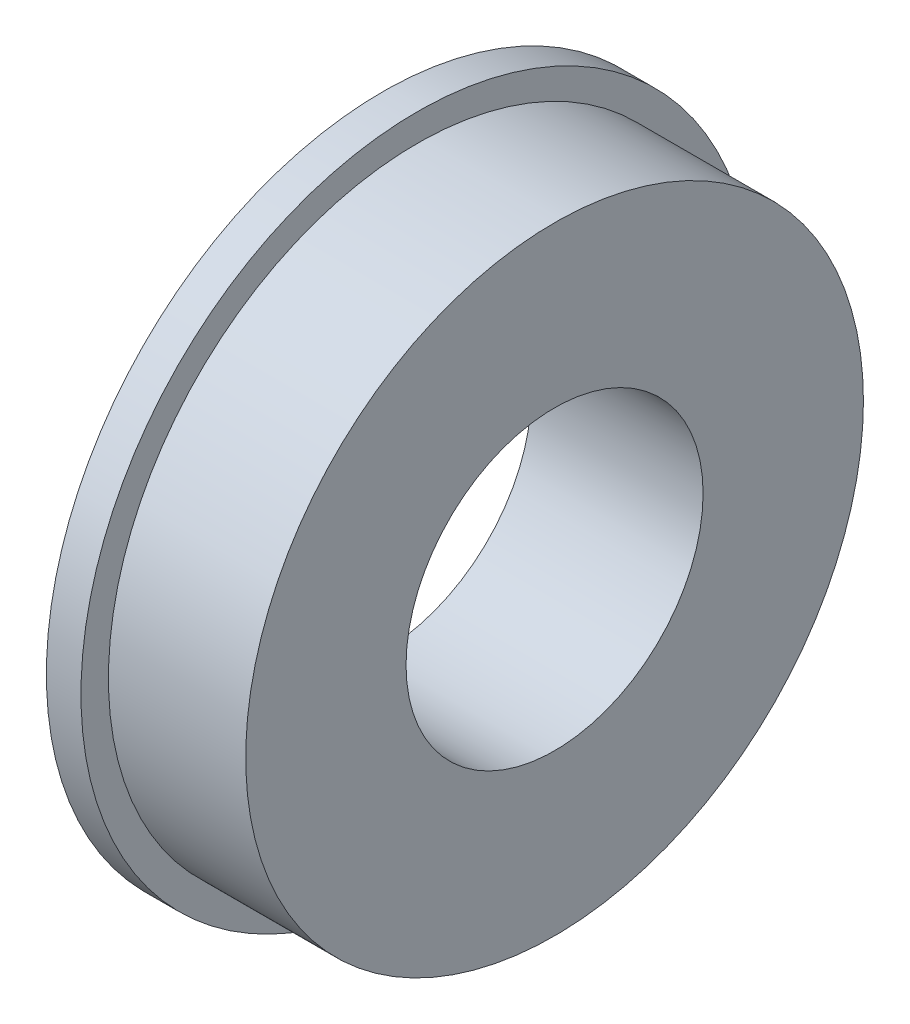
ISO-10303-21;
HEADER;
FILE_DESCRIPTION(('STEP AP214'),'2;1');
FILE_NAME('part.step','',(''),(''),'','','');
FILE_SCHEMA(('AUTOMOTIVE_DESIGN { 1 0 10303 214 1 1 1 1 }'));
ENDSEC;
DATA;
#1=APPLICATION_CONTEXT('core data for automotive mechanical design processes');
#2=APPLICATION_PROTOCOL_DEFINITION('international standard','automotive_design',2000,#1);
#3=PRODUCT_CONTEXT('',#1,'mechanical');
#4=PRODUCT('Part','Part','',(#3));
#5=PRODUCT_RELATED_PRODUCT_CATEGORY('part','',(#4));
#6=PRODUCT_DEFINITION_FORMATION('','',#4);
#7=PRODUCT_DEFINITION_CONTEXT('part definition',#1,'design');
#8=PRODUCT_DEFINITION('design','',#6,#7);
#9=PRODUCT_DEFINITION_SHAPE('','',#8);
#10=(LENGTH_UNIT() NAMED_UNIT(*) SI_UNIT(.MILLI.,.METRE.));
#11=(NAMED_UNIT(*) PLANE_ANGLE_UNIT() SI_UNIT($,.RADIAN.));
#12=(NAMED_UNIT(*) SI_UNIT($,.STERADIAN.) SOLID_ANGLE_UNIT());
#13=UNCERTAINTY_MEASURE_WITH_UNIT(LENGTH_MEASURE(1.E-05),#10,'distance_accuracy_value','');
#14=(GEOMETRIC_REPRESENTATION_CONTEXT(3) GLOBAL_UNCERTAINTY_ASSIGNED_CONTEXT((#13)) GLOBAL_UNIT_ASSIGNED_CONTEXT((#10,
#11,#12)) REPRESENTATION_CONTEXT('',''));
#15=CARTESIAN_POINT('',(0.,0.,0.));
#16=DIRECTION('',(0.,0.,1.));
#17=DIRECTION('',(1.,0.,0.));
#18=AXIS2_PLACEMENT_3D('',#15,#16,#17);
#19=CARTESIAN_POINT('',(-3.97509999999998,3.97509999999537,0.));
#20=DIRECTION('',(-1.,-1.16271575700821E-12,0.));
#21=DIRECTION('',(0.,0.,1.));
#22=AXIS2_PLACEMENT_3D('',#19,#20,#21);
#23=PLANE('',#22);
#24=CARTESIAN_POINT('',(-3.97509999999998,3.97509999999537,0.));
#25=DIRECTION('',(1.,1.16271575700821E-12,0.));
#26=DIRECTION('',(0.,0.,-1.));
#27=AXIS2_PLACEMENT_3D('',#24,#25,#26);
#28=CIRCLE('',#27,6.8707);
#29=CARTESIAN_POINT('',(-3.97509999999998,3.97509999999537,-6.8707));
#30=VERTEX_POINT('',#29);
#31=EDGE_CURVE('E10',#30,#30,#28,.T.);
#32=ORIENTED_EDGE('',*,*,#31,.T.);
#33=EDGE_LOOP('',(#32));
#34=FACE_BOUND('',#33,.T.);
#35=CARTESIAN_POINT('',(-3.97509999999998,3.97509999999537,0.));
#36=DIRECTION('',(1.,1.16271575700821E-12,0.));
#37=DIRECTION('',(0.,0.,-1.));
#38=AXIS2_PLACEMENT_3D('',#35,#36,#37);
#39=CIRCLE('',#38,9.7663);
#40=CARTESIAN_POINT('',(-3.97509999999998,3.97509999999537,-9.7663));
#41=VERTEX_POINT('',#40);
#42=EDGE_CURVE('E84',#41,#41,#39,.T.);
#43=ORIENTED_EDGE('',*,*,#42,.F.);
#44=EDGE_LOOP('',(#43));
#45=FACE_BOUND('',#44,.T.);
#46=ADVANCED_FACE('F41',(#34,#45),#23,.T.);
#47=CARTESIAN_POINT('',(3.97510000000002,3.97510000000461,0.));
#48=DIRECTION('',(1.,1.16271575700821E-12,0.));
#49=DIRECTION('',(0.,0.,-1.));
#50=AXIS2_PLACEMENT_3D('',#47,#48,#49);
#51=CYLINDRICAL_SURFACE('',#50,6.8707);
#52=CARTESIAN_POINT('',(3.97510000000002,3.97510000000461,0.));
#53=DIRECTION('',(1.,1.16271575700821E-12,0.));
#54=DIRECTION('',(0.,0.,-1.));
#55=AXIS2_PLACEMENT_3D('',#52,#53,#54);
#56=CIRCLE('',#55,6.8707);
#57=CARTESIAN_POINT('',(3.97510000000002,3.97510000000461,-6.8707));
#58=VERTEX_POINT('',#57);
#59=EDGE_CURVE('E48',#58,#58,#56,.T.);
#60=ORIENTED_EDGE('',*,*,#59,.T.);
#61=EDGE_LOOP('',(#60));
#62=FACE_BOUND('',#61,.T.);
#63=ORIENTED_EDGE('',*,*,#31,.F.);
#64=EDGE_LOOP('',(#63));
#65=FACE_BOUND('',#64,.T.);
#66=ADVANCED_FACE('F93',(#62,#65),#51,.F.);
#67=CARTESIAN_POINT('',(3.97510000000002,3.97510000000461,0.));
#68=DIRECTION('',(1.,1.16271575700821E-12,0.));
#69=DIRECTION('',(0.,0.,-1.));
#70=AXIS2_PLACEMENT_3D('',#67,#68,#69);
#71=PLANE('',#70);
#72=CARTESIAN_POINT('',(3.97510000000002,3.97510000000461,0.));
#73=DIRECTION('',(1.,1.16271575700821E-12,0.));
#74=DIRECTION('',(0.,0.,-1.));
#75=AXIS2_PLACEMENT_3D('',#72,#73,#74);
#76=CIRCLE('',#75,14.2875);
#77=CARTESIAN_POINT('',(3.97510000000002,3.97510000000461,-14.2875));
#78=VERTEX_POINT('',#77);
#79=EDGE_CURVE('E53',#78,#78,#76,.T.);
#80=ORIENTED_EDGE('',*,*,#79,.T.);
#81=EDGE_LOOP('',(#80));
#82=FACE_BOUND('',#81,.T.);
#83=ORIENTED_EDGE('',*,*,#59,.F.);
#84=EDGE_LOOP('',(#83));
#85=FACE_BOUND('',#84,.T.);
#86=ADVANCED_FACE('F97',(#82,#85),#71,.T.);
#87=CARTESIAN_POINT('',(3.97510000000002,3.97510000000461,0.));
#88=DIRECTION('',(1.,1.16271575700821E-12,0.));
#89=DIRECTION('',(0.,0.,-1.));
#90=AXIS2_PLACEMENT_3D('',#87,#88,#89);
#91=CYLINDRICAL_SURFACE('',#90,14.2875);
#92=CARTESIAN_POINT('',(-2.37489999999998,3.97509999999723,0.));
#93=DIRECTION('',(1.,1.16271575700821E-12,0.));
#94=DIRECTION('',(0.,0.,-1.));
#95=AXIS2_PLACEMENT_3D('',#92,#93,#94);
#96=CIRCLE('',#95,14.2875);
#97=CARTESIAN_POINT('',(-2.37489999999998,3.97509999999723,-14.2875));
#98=VERTEX_POINT('',#97);
#99=EDGE_CURVE('E58',#98,#98,#96,.T.);
#100=ORIENTED_EDGE('',*,*,#99,.T.);
#101=EDGE_LOOP('',(#100));
#102=FACE_BOUND('',#101,.T.);
#103=ORIENTED_EDGE('',*,*,#79,.F.);
#104=EDGE_LOOP('',(#103));
#105=FACE_BOUND('',#104,.T.);
#106=ADVANCED_FACE('F101',(#102,#105),#91,.T.);
#107=CARTESIAN_POINT('',(-2.37489999999998,3.97509999999723,0.));
#108=DIRECTION('',(1.,1.16271575700821E-12,0.));
#109=DIRECTION('',(0.,0.,-1.));
#110=AXIS2_PLACEMENT_3D('',#107,#108,#109);
#111=PLANE('',#110);
#112=CARTESIAN_POINT('',(-2.37489999999998,3.97509999999723,0.));
#113=DIRECTION('',(1.,1.16271575700821E-12,0.));
#114=DIRECTION('',(0.,0.,-1.));
#115=AXIS2_PLACEMENT_3D('',#112,#113,#114);
#116=CIRCLE('',#115,15.5575);
#117=CARTESIAN_POINT('',(-2.37489999999998,3.97509999999723,-15.5575));
#118=VERTEX_POINT('',#117);
#119=EDGE_CURVE('E64',#118,#118,#116,.T.);
#120=ORIENTED_EDGE('',*,*,#119,.T.);
#121=EDGE_LOOP('',(#120));
#122=FACE_BOUND('',#121,.T.);
#123=ORIENTED_EDGE('',*,*,#99,.F.);
#124=EDGE_LOOP('',(#123));
#125=FACE_BOUND('',#124,.T.);
#126=ADVANCED_FACE('F108',(#122,#125),#111,.T.);
#127=CARTESIAN_POINT('',(3.97510000000002,3.97510000000461,0.));
#128=DIRECTION('',(1.,1.16271575700821E-12,0.));
#129=DIRECTION('',(0.,0.,-1.));
#130=AXIS2_PLACEMENT_3D('',#127,#128,#129);
#131=CYLINDRICAL_SURFACE('',#130,15.5575);
#132=CARTESIAN_POINT('',(-3.97509999999998,3.97509999999537,0.));
#133=DIRECTION('',(1.,1.16271575700821E-12,0.));
#134=DIRECTION('',(0.,0.,-1.));
#135=AXIS2_PLACEMENT_3D('',#132,#133,#134);
#136=CIRCLE('',#135,15.5575);
#137=CARTESIAN_POINT('',(-3.97509999999998,3.97509999999537,-15.5575));
#138=VERTEX_POINT('',#137);
#139=EDGE_CURVE('E68',#138,#138,#136,.T.);
#140=ORIENTED_EDGE('',*,*,#139,.T.);
#141=EDGE_LOOP('',(#140));
#142=FACE_BOUND('',#141,.T.);
#143=ORIENTED_EDGE('',*,*,#119,.F.);
#144=EDGE_LOOP('',(#143));
#145=FACE_BOUND('',#144,.T.);
#146=ADVANCED_FACE('F112',(#142,#145),#131,.T.);
#147=CARTESIAN_POINT('',(-3.97509999999998,3.97509999999537,0.));
#148=DIRECTION('',(-1.,-1.16271575700821E-12,0.));
#149=DIRECTION('',(0.,0.,1.));
#150=AXIS2_PLACEMENT_3D('',#147,#148,#149);
#151=PLANE('',#150);
#152=CARTESIAN_POINT('',(-3.97509999999998,3.97509999999537,0.));
#153=DIRECTION('',(1.,1.16271575700821E-12,0.));
#154=DIRECTION('',(0.,0.,-1.));
#155=AXIS2_PLACEMENT_3D('',#152,#153,#154);
#156=CIRCLE('',#155,12.6619);
#157=CARTESIAN_POINT('',(-3.97509999999998,3.97509999999537,-12.6619));
#158=VERTEX_POINT('',#157);
#159=EDGE_CURVE('E72',#158,#158,#156,.T.);
#160=ORIENTED_EDGE('',*,*,#159,.T.);
#161=EDGE_LOOP('',(#160));
#162=FACE_BOUND('',#161,.T.);
#163=ORIENTED_EDGE('',*,*,#139,.F.);
#164=EDGE_LOOP('',(#163));
#165=FACE_BOUND('',#164,.T.);
#166=ADVANCED_FACE('F116',(#162,#165),#151,.T.);
#167=CARTESIAN_POINT('',(3.97510000000002,3.97510000000461,0.));
#168=DIRECTION('',(1.,1.16271575700821E-12,0.));
#169=DIRECTION('',(0.,0.,-1.));
#170=AXIS2_PLACEMENT_3D('',#167,#168,#169);
#171=CYLINDRICAL_SURFACE('',#170,12.6619);
#172=CARTESIAN_POINT('',(-3.34009999999998,3.97509999999611,0.));
#173=DIRECTION('',(1.,1.16271575700821E-12,0.));
#174=DIRECTION('',(0.,0.,-1.));
#175=AXIS2_PLACEMENT_3D('',#172,#173,#174);
#176=CIRCLE('',#175,12.6619);
#177=CARTESIAN_POINT('',(-3.34009999999998,3.97509999999611,-12.6619));
#178=VERTEX_POINT('',#177);
#179=EDGE_CURVE('E76',#178,#178,#176,.T.);
#180=ORIENTED_EDGE('',*,*,#179,.T.);
#181=EDGE_LOOP('',(#180));
#182=FACE_BOUND('',#181,.T.);
#183=ORIENTED_EDGE('',*,*,#159,.F.);
#184=EDGE_LOOP('',(#183));
#185=FACE_BOUND('',#184,.T.);
#186=ADVANCED_FACE('F120',(#182,#185),#171,.F.);
#187=CARTESIAN_POINT('',(-3.34009999999998,3.97509999999611,0.));
#188=DIRECTION('',(-1.,-1.16271575700821E-12,0.));
#189=DIRECTION('',(0.,0.,1.));
#190=AXIS2_PLACEMENT_3D('',#187,#188,#189);
#191=PLANE('',#190);
#192=CARTESIAN_POINT('',(-3.34009999999998,3.97509999999611,0.));
#193=DIRECTION('',(1.,1.16271575700821E-12,0.));
#194=DIRECTION('',(0.,0.,-1.));
#195=AXIS2_PLACEMENT_3D('',#192,#193,#194);
#196=CIRCLE('',#195,9.7663);
#197=CARTESIAN_POINT('',(-3.34009999999998,3.97509999999611,-9.7663));
#198=VERTEX_POINT('',#197);
#199=EDGE_CURVE('E80',#198,#198,#196,.T.);
#200=ORIENTED_EDGE('',*,*,#199,.T.);
#201=EDGE_LOOP('',(#200));
#202=FACE_BOUND('',#201,.T.);
#203=ORIENTED_EDGE('',*,*,#179,.F.);
#204=EDGE_LOOP('',(#203));
#205=FACE_BOUND('',#204,.T.);
#206=ADVANCED_FACE('F124',(#202,#205),#191,.T.);
#207=CARTESIAN_POINT('',(3.97510000000002,3.97510000000461,0.));
#208=DIRECTION('',(1.,1.16271575700821E-12,0.));
#209=DIRECTION('',(0.,0.,-1.));
#210=AXIS2_PLACEMENT_3D('',#207,#208,#209);
#211=CYLINDRICAL_SURFACE('',#210,9.7663);
#212=ORIENTED_EDGE('',*,*,#42,.T.);
#213=EDGE_LOOP('',(#212));
#214=FACE_BOUND('',#213,.T.);
#215=ORIENTED_EDGE('',*,*,#199,.F.);
#216=EDGE_LOOP('',(#215));
#217=FACE_BOUND('',#216,.T.);
#218=ADVANCED_FACE('F89',(#214,#217),#211,.T.);
#219=CLOSED_SHELL('',(#46,#66,#86,#106,#126,#146,#166,#186,#206,#218));
#220=MANIFOLD_SOLID_BREP('B2',#219);
#221=ADVANCED_BREP_SHAPE_REPRESENTATION('',(#18,#220),#14);
#222=SHAPE_DEFINITION_REPRESENTATION(#9,#221);
ENDSEC;
END-ISO-10303-21;
